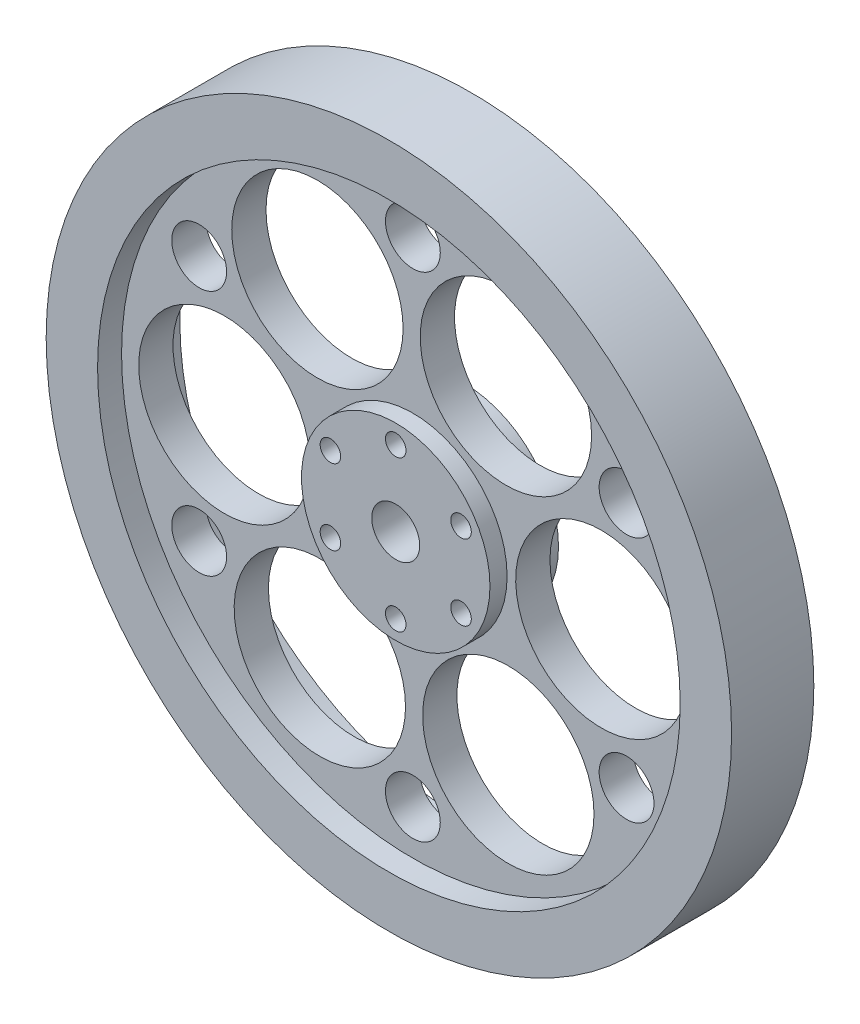
ISO-10303-21;
HEADER;
FILE_DESCRIPTION(('STEP AP214'),'2;1');
FILE_NAME('part.step','',(''),(''),'','','');
FILE_SCHEMA(('AUTOMOTIVE_DESIGN { 1 0 10303 214 1 1 1 1 }'));
ENDSEC;
DATA;
#1=APPLICATION_CONTEXT('core data for automotive mechanical design processes');
#2=APPLICATION_PROTOCOL_DEFINITION('international standard','automotive_design',2000,#1);
#3=PRODUCT_CONTEXT('',#1,'mechanical');
#4=PRODUCT('Part','Part','',(#3));
#5=PRODUCT_RELATED_PRODUCT_CATEGORY('part','',(#4));
#6=PRODUCT_DEFINITION_FORMATION('','',#4);
#7=PRODUCT_DEFINITION_CONTEXT('part definition',#1,'design');
#8=PRODUCT_DEFINITION('design','',#6,#7);
#9=PRODUCT_DEFINITION_SHAPE('','',#8);
#10=(LENGTH_UNIT() NAMED_UNIT(*) SI_UNIT(.MILLI.,.METRE.));
#11=(NAMED_UNIT(*) PLANE_ANGLE_UNIT() SI_UNIT($,.RADIAN.));
#12=(NAMED_UNIT(*) SI_UNIT($,.STERADIAN.) SOLID_ANGLE_UNIT());
#13=UNCERTAINTY_MEASURE_WITH_UNIT(LENGTH_MEASURE(1.E-05),#10,'distance_accuracy_value','');
#14=(GEOMETRIC_REPRESENTATION_CONTEXT(3) GLOBAL_UNCERTAINTY_ASSIGNED_CONTEXT((#13)) GLOBAL_UNIT_ASSIGNED_CONTEXT((#10,
#11,#12)) REPRESENTATION_CONTEXT('',''));
#15=CARTESIAN_POINT('',(0.,0.,0.));
#16=DIRECTION('',(0.,0.,1.));
#17=DIRECTION('',(1.,0.,0.));
#18=AXIS2_PLACEMENT_3D('',#15,#16,#17);
#19=CARTESIAN_POINT('',(0.,0.,-10.));
#20=DIRECTION('',(0.,0.,1.));
#21=DIRECTION('',(1.,0.,0.));
#22=AXIS2_PLACEMENT_3D('',#19,#20,#21);
#23=CYLINDRICAL_SURFACE('',#22,27.5);
#24=CARTESIAN_POINT('',(0.,0.,-10.));
#25=DIRECTION('',(0.,0.,1.));
#26=DIRECTION('',(1.,0.,0.));
#27=AXIS2_PLACEMENT_3D('',#24,#25,#26);
#28=CIRCLE('',#27,27.5);
#29=CARTESIAN_POINT('',(27.5,0.,-10.));
#30=VERTEX_POINT('',#29);
#31=EDGE_CURVE('E46',#30,#30,#28,.T.);
#32=ORIENTED_EDGE('',*,*,#31,.T.);
#33=EDGE_LOOP('',(#32));
#34=FACE_BOUND('',#33,.T.);
#35=CARTESIAN_POINT('',(0.,0.,-5.));
#36=DIRECTION('',(0.,0.,1.));
#37=DIRECTION('',(1.,0.,0.));
#38=AXIS2_PLACEMENT_3D('',#35,#36,#37);
#39=CIRCLE('',#38,27.5);
#40=CARTESIAN_POINT('',(27.5,0.,-5.));
#41=VERTEX_POINT('',#40);
#42=EDGE_CURVE('E175',#41,#41,#39,.T.);
#43=ORIENTED_EDGE('',*,*,#42,.F.);
#44=EDGE_LOOP('',(#43));
#45=FACE_BOUND('',#44,.T.);
#46=ADVANCED_FACE('F38',(#34,#45),#23,.T.);
#47=CARTESIAN_POINT('',(0.,0.,-10.));
#48=DIRECTION('',(0.,0.,1.));
#49=DIRECTION('',(1.,0.,0.));
#50=AXIS2_PLACEMENT_3D('',#47,#48,#49);
#51=PLANE('',#50);
#52=CARTESIAN_POINT('',(19.0525588832581,11.0000000000008,-10.));
#53=DIRECTION('',(0.,0.,1.));
#54=DIRECTION('',(1.,0.,0.));
#55=AXIS2_PLACEMENT_3D('',#52,#53,#54);
#56=CIRCLE('',#55,3.);
#57=CARTESIAN_POINT('',(22.0525588832581,11.0000000000008,-10.));
#58=VERTEX_POINT('',#57);
#59=EDGE_CURVE('E151',#58,#58,#56,.T.);
#60=ORIENTED_EDGE('',*,*,#59,.T.);
#61=EDGE_LOOP('',(#60));
#62=FACE_BOUND('',#61,.T.);
#63=CARTESIAN_POINT('',(0.,22.,-10.));
#64=DIRECTION('',(0.,0.,1.));
#65=DIRECTION('',(1.,0.,0.));
#66=AXIS2_PLACEMENT_3D('',#63,#64,#65);
#67=CIRCLE('',#66,3.);
#68=CARTESIAN_POINT('',(3.,22.,-10.));
#69=VERTEX_POINT('',#68);
#70=EDGE_CURVE('E148',#69,#69,#67,.T.);
#71=ORIENTED_EDGE('',*,*,#70,.T.);
#72=EDGE_LOOP('',(#71));
#73=FACE_BOUND('',#72,.T.);
#74=CARTESIAN_POINT('',(-19.0525588832572,10.9999999999992,-10.));
#75=DIRECTION('',(0.,0.,1.));
#76=DIRECTION('',(1.,0.,0.));
#77=AXIS2_PLACEMENT_3D('',#74,#75,#76);
#78=CIRCLE('',#77,3.);
#79=CARTESIAN_POINT('',(-16.0525588832572,10.9999999999992,-10.));
#80=VERTEX_POINT('',#79);
#81=EDGE_CURVE('E145',#80,#80,#78,.T.);
#82=ORIENTED_EDGE('',*,*,#81,.T.);
#83=EDGE_LOOP('',(#82));
#84=FACE_BOUND('',#83,.T.);
#85=CARTESIAN_POINT('',(19.052558883259,-10.9999999999992,-10.));
#86=DIRECTION('',(0.,0.,1.));
#87=DIRECTION('',(1.,0.,0.));
#88=AXIS2_PLACEMENT_3D('',#85,#86,#87);
#89=CIRCLE('',#88,3.);
#90=CARTESIAN_POINT('',(22.052558883259,-10.9999999999992,-10.));
#91=VERTEX_POINT('',#90);
#92=EDGE_CURVE('E142',#91,#91,#89,.T.);
#93=ORIENTED_EDGE('',*,*,#92,.T.);
#94=EDGE_LOOP('',(#93));
#95=FACE_BOUND('',#94,.T.);
#96=CARTESIAN_POINT('',(1.83646022075986E-12,-22.,-10.));
#97=DIRECTION('',(0.,0.,1.));
#98=DIRECTION('',(1.,0.,0.));
#99=AXIS2_PLACEMENT_3D('',#96,#97,#98);
#100=CIRCLE('',#99,3.);
#101=CARTESIAN_POINT('',(3.00000000000184,-22.,-10.));
#102=VERTEX_POINT('',#101);
#103=EDGE_CURVE('E139',#102,#102,#100,.T.);
#104=ORIENTED_EDGE('',*,*,#103,.T.);
#105=EDGE_LOOP('',(#104));
#106=FACE_BOUND('',#105,.T.);
#107=CARTESIAN_POINT('',(-19.0525588832563,-11.0000000000008,-10.));
#108=DIRECTION('',(0.,0.,1.));
#109=DIRECTION('',(1.,0.,0.));
#110=AXIS2_PLACEMENT_3D('',#107,#108,#109);
#111=CIRCLE('',#110,3.);
#112=CARTESIAN_POINT('',(-16.0525588832563,-11.0000000000008,-10.));
#113=VERTEX_POINT('',#112);
#114=EDGE_CURVE('E136',#113,#113,#111,.T.);
#115=ORIENTED_EDGE('',*,*,#114,.T.);
#116=EDGE_LOOP('',(#115));
#117=FACE_BOUND('',#116,.T.);
#118=CARTESIAN_POINT('',(0.,0.,-10.));
#119=DIRECTION('',(0.,0.,1.));
#120=DIRECTION('',(1.,0.,0.));
#121=AXIS2_PLACEMENT_3D('',#118,#119,#120);
#122=CIRCLE('',#121,7.);
#123=CARTESIAN_POINT('',(7.,0.,-10.));
#124=VERTEX_POINT('',#123);
#125=EDGE_CURVE('E157',#124,#124,#122,.T.);
#126=ORIENTED_EDGE('',*,*,#125,.T.);
#127=EDGE_LOOP('',(#126));
#128=FACE_BOUND('',#127,.T.);
#129=ORIENTED_EDGE('',*,*,#31,.F.);
#130=EDGE_LOOP('',(#129));
#131=FACE_BOUND('',#130,.T.);
#132=ADVANCED_FACE('F199',(#62,#73,#84,#95,#106,#117,#128,#131),#51,.F.);
#133=CARTESIAN_POINT('',(0.,0.,-5.));
#134=DIRECTION('',(0.,0.,1.));
#135=DIRECTION('',(1.,0.,0.));
#136=AXIS2_PLACEMENT_3D('',#133,#134,#135);
#137=PLANE('',#136);
#138=CARTESIAN_POINT('',(-27.1468431942554,-47.8335541705455,-5.));
#139=DIRECTION('',(0.,0.,-1.));
#140=DIRECTION('',(0.500000000000004,-0.866025403784436,0.));
#141=AXIS2_PLACEMENT_3D('',#138,#139,#140);
#142=CIRCLE('',#141,25.);
#143=CARTESIAN_POINT('',(-14.6468431942553,-69.4841892651564,-5.));
#144=VERTEX_POINT('',#143);
#145=EDGE_CURVE('E324',#144,#144,#142,.T.);
#146=ORIENTED_EDGE('',*,*,#145,.F.);
#147=EDGE_LOOP('',(#146));
#148=FACE_BOUND('',#147,.T.);
#149=CARTESIAN_POINT('',(27.8516514678636,-47.4266329240507,-5.));
#150=DIRECTION('',(0.,0.,-1.));
#151=DIRECTION('',(1.,0.,0.));
#152=AXIS2_PLACEMENT_3D('',#149,#150,#151);
#153=CIRCLE('',#152,25.);
#154=CARTESIAN_POINT('',(52.8516514678636,-47.4266329240507,-5.));
#155=VERTEX_POINT('',#154);
#156=EDGE_CURVE('E321',#155,#155,#153,.T.);
#157=ORIENTED_EDGE('',*,*,#156,.F.);
#158=EDGE_LOOP('',(#157));
#159=FACE_BOUND('',#158,.T.);
#160=CARTESIAN_POINT('',(27.146843194255,47.8335541705457,-5.));
#161=DIRECTION('',(0.,0.,-1.));
#162=DIRECTION('',(-0.50000000000001,0.866025403784433,0.));
#163=AXIS2_PLACEMENT_3D('',#160,#161,#162);
#164=CIRCLE('',#163,25.);
#165=CARTESIAN_POINT('',(14.6468431942548,69.4841892651565,-5.));
#166=VERTEX_POINT('',#165);
#167=EDGE_CURVE('E316',#166,#166,#164,.T.);
#168=ORIENTED_EDGE('',*,*,#167,.F.);
#169=EDGE_LOOP('',(#168));
#170=FACE_BOUND('',#169,.T.);
#171=CARTESIAN_POINT('',(54.9984946621192,0.406921246495152,-5.));
#172=DIRECTION('',(0.,0.,-1.));
#173=DIRECTION('',(0.499999999999992,0.866025403784443,0.));
#174=AXIS2_PLACEMENT_3D('',#171,#172,#173);
#175=CIRCLE('',#174,25.);
#176=CARTESIAN_POINT('',(67.498494662119,22.0575563411062,-5.));
#177=VERTEX_POINT('',#176);
#178=EDGE_CURVE('E318',#177,#177,#175,.T.);
#179=ORIENTED_EDGE('',*,*,#178,.F.);
#180=EDGE_LOOP('',(#179));
#181=FACE_BOUND('',#180,.T.);
#182=CARTESIAN_POINT('',(-54.9984946621192,-0.40692124649477,-5.));
#183=DIRECTION('',(0.,0.,-1.));
#184=DIRECTION('',(-0.499999999999998,-0.86602540378444,0.));
#185=AXIS2_PLACEMENT_3D('',#182,#183,#184);
#186=CIRCLE('',#185,25.);
#187=CARTESIAN_POINT('',(-67.4984946621191,-22.0575563411058,-5.));
#188=VERTEX_POINT('',#187);
#189=EDGE_CURVE('E89',#188,#188,#186,.T.);
#190=ORIENTED_EDGE('',*,*,#189,.F.);
#191=EDGE_LOOP('',(#190));
#192=FACE_BOUND('',#191,.T.);
#193=CARTESIAN_POINT('',(-27.8516514678636,47.4266329240507,-5.));
#194=DIRECTION('',(0.,0.,-1.));
#195=DIRECTION('',(-1.,0.,0.));
#196=AXIS2_PLACEMENT_3D('',#193,#194,#195);
#197=CIRCLE('',#196,25.);
#198=CARTESIAN_POINT('',(-52.8516514678636,47.4266329240507,-5.));
#199=VERTEX_POINT('',#198);
#200=EDGE_CURVE('E84',#199,#199,#197,.T.);
#201=ORIENTED_EDGE('',*,*,#200,.F.);
#202=EDGE_LOOP('',(#201));
#203=FACE_BOUND('',#202,.T.);
#204=CARTESIAN_POINT('',(-62.3538290724782,-36.0000000000008,-5.));
#205=DIRECTION('',(0.,0.,1.));
#206=DIRECTION('',(1.,0.,0.));
#207=AXIS2_PLACEMENT_3D('',#204,#205,#206);
#208=CIRCLE('',#207,8.);
#209=CARTESIAN_POINT('',(-54.3538290724782,-36.0000000000008,-5.));
#210=VERTEX_POINT('',#209);
#211=EDGE_CURVE('E79',#210,#210,#208,.T.);
#212=ORIENTED_EDGE('',*,*,#211,.T.);
#213=EDGE_LOOP('',(#212));
#214=FACE_BOUND('',#213,.T.);
#215=CARTESIAN_POINT('',(1.8425834547556E-12,-72.,-5.));
#216=DIRECTION('',(0.,0.,1.));
#217=DIRECTION('',(1.,0.,0.));
#218=AXIS2_PLACEMENT_3D('',#215,#216,#217);
#219=CIRCLE('',#218,8.);
#220=CARTESIAN_POINT('',(8.00000000000184,-72.,-5.));
#221=VERTEX_POINT('',#220);
#222=EDGE_CURVE('E75',#221,#221,#219,.T.);
#223=ORIENTED_EDGE('',*,*,#222,.T.);
#224=EDGE_LOOP('',(#223));
#225=FACE_BOUND('',#224,.T.);
#226=CARTESIAN_POINT('',(62.353829072481,-35.9999999999992,-5.));
#227=DIRECTION('',(0.,0.,1.));
#228=DIRECTION('',(1.,0.,0.));
#229=AXIS2_PLACEMENT_3D('',#226,#227,#228);
#230=CIRCLE('',#229,8.00000000000001);
#231=CARTESIAN_POINT('',(70.353829072481,-35.9999999999992,-5.));
#232=VERTEX_POINT('',#231);
#233=EDGE_CURVE('E71',#232,#232,#230,.T.);
#234=ORIENTED_EDGE('',*,*,#233,.T.);
#235=EDGE_LOOP('',(#234));
#236=FACE_BOUND('',#235,.T.);
#237=CARTESIAN_POINT('',(62.35382907248,36.0000000000008,-5.));
#238=DIRECTION('',(0.,0.,1.));
#239=DIRECTION('',(1.,0.,0.));
#240=AXIS2_PLACEMENT_3D('',#237,#238,#239);
#241=CIRCLE('',#240,8.);
#242=CARTESIAN_POINT('',(70.35382907248,36.0000000000008,-5.));
#243=VERTEX_POINT('',#242);
#244=EDGE_CURVE('E67',#243,#243,#241,.T.);
#245=ORIENTED_EDGE('',*,*,#244,.T.);
#246=EDGE_LOOP('',(#245));
#247=FACE_BOUND('',#246,.T.);
#248=CARTESIAN_POINT('',(0.,72.,-5.));
#249=DIRECTION('',(0.,0.,1.));
#250=DIRECTION('',(1.,0.,0.));
#251=AXIS2_PLACEMENT_3D('',#248,#249,#250);
#252=CIRCLE('',#251,8.);
#253=CARTESIAN_POINT('',(8.,72.,-5.));
#254=VERTEX_POINT('',#253);
#255=EDGE_CURVE('E63',#254,#254,#252,.T.);
#256=ORIENTED_EDGE('',*,*,#255,.T.);
#257=EDGE_LOOP('',(#256));
#258=FACE_BOUND('',#257,.T.);
#259=CARTESIAN_POINT('',(-62.3538290724792,35.9999999999992,-5.));
#260=DIRECTION('',(0.,0.,1.));
#261=DIRECTION('',(1.,0.,0.));
#262=AXIS2_PLACEMENT_3D('',#259,#260,#261);
#263=CIRCLE('',#262,8.);
#264=CARTESIAN_POINT('',(-54.3538290724792,35.9999999999992,-5.));
#265=VERTEX_POINT('',#264);
#266=EDGE_CURVE('E58',#265,#265,#263,.T.);
#267=ORIENTED_EDGE('',*,*,#266,.T.);
#268=EDGE_LOOP('',(#267));
#269=FACE_BOUND('',#268,.T.);
#270=ORIENTED_EDGE('',*,*,#42,.T.);
#271=EDGE_LOOP('',(#270));
#272=FACE_BOUND('',#271,.T.);
#273=CARTESIAN_POINT('',(0.,0.,-5.));
#274=DIRECTION('',(0.,0.,1.));
#275=DIRECTION('',(1.,0.,0.));
#276=AXIS2_PLACEMENT_3D('',#273,#274,#275);
#277=CIRCLE('',#276,85.);
#278=CARTESIAN_POINT('',(85.,0.,-5.));
#279=VERTEX_POINT('',#278);
#280=EDGE_CURVE('E178',#279,#279,#277,.T.);
#281=ORIENTED_EDGE('',*,*,#280,.F.);
#282=EDGE_LOOP('',(#281));
#283=FACE_BOUND('',#282,.T.);
#284=ADVANCED_FACE('F204',(#148,#159,#170,#181,#192,#203,#214,#225,#236,#247,#258,#269,#272,
#283),#137,.F.);
#285=CARTESIAN_POINT('',(0.,0.,-12.));
#286=DIRECTION('',(0.,0.,1.));
#287=DIRECTION('',(1.,0.,0.));
#288=AXIS2_PLACEMENT_3D('',#285,#286,#287);
#289=CYLINDRICAL_SURFACE('',#288,85.);
#290=CARTESIAN_POINT('',(0.,0.,-12.));
#291=DIRECTION('',(0.,0.,1.));
#292=DIRECTION('',(1.,0.,0.));
#293=AXIS2_PLACEMENT_3D('',#290,#291,#292);
#294=CIRCLE('',#293,85.);
#295=CARTESIAN_POINT('',(85.,0.,-12.));
#296=VERTEX_POINT('',#295);
#297=EDGE_CURVE('E166',#296,#296,#294,.T.);
#298=ORIENTED_EDGE('',*,*,#297,.F.);
#299=EDGE_LOOP('',(#298));
#300=FACE_BOUND('',#299,.T.);
#301=ORIENTED_EDGE('',*,*,#280,.T.);
#302=EDGE_LOOP('',(#301));
#303=FACE_BOUND('',#302,.T.);
#304=ADVANCED_FACE('F212',(#300,#303),#289,.F.);
#305=CARTESIAN_POINT('',(0.,0.,5.));
#306=DIRECTION('',(0.,0.,1.));
#307=DIRECTION('',(1.,0.,0.));
#308=AXIS2_PLACEMENT_3D('',#305,#306,#307);
#309=CIRCLE('',#308,85.);
#310=CARTESIAN_POINT('',(85.,0.,5.));
#311=VERTEX_POINT('',#310);
#312=EDGE_CURVE('E172',#311,#311,#309,.T.);
#313=ORIENTED_EDGE('',*,*,#312,.F.);
#314=EDGE_LOOP('',(#313));
#315=FACE_BOUND('',#314,.T.);
#316=CARTESIAN_POINT('',(0.,0.,12.));
#317=DIRECTION('',(0.,0.,1.));
#318=DIRECTION('',(1.,0.,0.));
#319=AXIS2_PLACEMENT_3D('',#316,#317,#318);
#320=CIRCLE('',#319,85.);
#321=CARTESIAN_POINT('',(85.,0.,12.));
#322=VERTEX_POINT('',#321);
#323=EDGE_CURVE('E160',#322,#322,#320,.T.);
#324=ORIENTED_EDGE('',*,*,#323,.T.);
#325=EDGE_LOOP('',(#324));
#326=FACE_BOUND('',#325,.T.);
#327=ADVANCED_FACE('F218',(#315,#326),#289,.F.);
#328=CARTESIAN_POINT('',(0.,0.,-12.));
#329=DIRECTION('',(0.,0.,1.));
#330=DIRECTION('',(1.,0.,0.));
#331=AXIS2_PLACEMENT_3D('',#328,#329,#330);
#332=CYLINDRICAL_SURFACE('',#331,100.);
#333=CARTESIAN_POINT('',(0.,0.,-12.));
#334=DIRECTION('',(0.,0.,1.));
#335=DIRECTION('',(1.,0.,0.));
#336=AXIS2_PLACEMENT_3D('',#333,#334,#335);
#337=CIRCLE('',#336,100.);
#338=CARTESIAN_POINT('',(100.,0.,-12.));
#339=VERTEX_POINT('',#338);
#340=EDGE_CURVE('E169',#339,#339,#337,.T.);
#341=ORIENTED_EDGE('',*,*,#340,.T.);
#342=EDGE_LOOP('',(#341));
#343=FACE_BOUND('',#342,.T.);
#344=CARTESIAN_POINT('',(0.,0.,12.));
#345=DIRECTION('',(0.,0.,1.));
#346=DIRECTION('',(1.,0.,0.));
#347=AXIS2_PLACEMENT_3D('',#344,#345,#346);
#348=CIRCLE('',#347,100.);
#349=CARTESIAN_POINT('',(100.,0.,12.));
#350=VERTEX_POINT('',#349);
#351=EDGE_CURVE('E163',#350,#350,#348,.T.);
#352=ORIENTED_EDGE('',*,*,#351,.F.);
#353=EDGE_LOOP('',(#352));
#354=FACE_BOUND('',#353,.T.);
#355=ADVANCED_FACE('F224',(#343,#354),#332,.T.);
#356=CARTESIAN_POINT('',(0.,0.,-12.));
#357=DIRECTION('',(0.,0.,1.));
#358=DIRECTION('',(1.,0.,0.));
#359=AXIS2_PLACEMENT_3D('',#356,#357,#358);
#360=PLANE('',#359);
#361=ORIENTED_EDGE('',*,*,#297,.T.);
#362=EDGE_LOOP('',(#361));
#363=FACE_BOUND('',#362,.T.);
#364=ORIENTED_EDGE('',*,*,#340,.F.);
#365=EDGE_LOOP('',(#364));
#366=FACE_BOUND('',#365,.T.);
#367=ADVANCED_FACE('F230',(#363,#366),#360,.F.);
#368=CARTESIAN_POINT('',(0.,0.,12.));
#369=DIRECTION('',(0.,0.,1.));
#370=DIRECTION('',(1.,0.,0.));
#371=AXIS2_PLACEMENT_3D('',#368,#369,#370);
#372=PLANE('',#371);
#373=ORIENTED_EDGE('',*,*,#323,.F.);
#374=EDGE_LOOP('',(#373));
#375=FACE_BOUND('',#374,.T.);
#376=ORIENTED_EDGE('',*,*,#351,.T.);
#377=EDGE_LOOP('',(#376));
#378=FACE_BOUND('',#377,.T.);
#379=ADVANCED_FACE('F195',(#375,#378),#372,.T.);
#380=CARTESIAN_POINT('',(0.,0.,10.));
#381=DIRECTION('',(0.,0.,1.));
#382=DIRECTION('',(1.,0.,0.));
#383=AXIS2_PLACEMENT_3D('',#380,#381,#382);
#384=PLANE('',#383);
#385=CARTESIAN_POINT('',(19.0525588832581,11.0000000000008,10.));
#386=DIRECTION('',(0.,0.,1.));
#387=DIRECTION('',(1.,0.,0.));
#388=AXIS2_PLACEMENT_3D('',#385,#386,#387);
#389=CIRCLE('',#388,3.);
#390=CARTESIAN_POINT('',(22.0525588832581,11.0000000000008,10.));
#391=VERTEX_POINT('',#390);
#392=EDGE_CURVE('E111',#391,#391,#389,.T.);
#393=ORIENTED_EDGE('',*,*,#392,.F.);
#394=EDGE_LOOP('',(#393));
#395=FACE_BOUND('',#394,.T.);
#396=CARTESIAN_POINT('',(0.,22.,10.));
#397=DIRECTION('',(0.,0.,1.));
#398=DIRECTION('',(1.,0.,0.));
#399=AXIS2_PLACEMENT_3D('',#396,#397,#398);
#400=CIRCLE('',#399,3.);
#401=CARTESIAN_POINT('',(3.,22.,10.));
#402=VERTEX_POINT('',#401);
#403=EDGE_CURVE('E119',#402,#402,#400,.T.);
#404=ORIENTED_EDGE('',*,*,#403,.F.);
#405=EDGE_LOOP('',(#404));
#406=FACE_BOUND('',#405,.T.);
#407=CARTESIAN_POINT('',(-19.0525588832572,10.9999999999992,10.));
#408=DIRECTION('',(0.,0.,1.));
#409=DIRECTION('',(1.,0.,0.));
#410=AXIS2_PLACEMENT_3D('',#407,#408,#409);
#411=CIRCLE('',#410,3.);
#412=CARTESIAN_POINT('',(-16.0525588832572,10.9999999999992,10.));
#413=VERTEX_POINT('',#412);
#414=EDGE_CURVE('E59',#413,#413,#411,.T.);
#415=ORIENTED_EDGE('',*,*,#414,.F.);
#416=EDGE_LOOP('',(#415));
#417=FACE_BOUND('',#416,.T.);
#418=CARTESIAN_POINT('',(19.052558883259,-10.9999999999992,10.));
#419=DIRECTION('',(0.,0.,1.));
#420=DIRECTION('',(1.,0.,0.));
#421=AXIS2_PLACEMENT_3D('',#418,#419,#420);
#422=CIRCLE('',#421,3.);
#423=CARTESIAN_POINT('',(22.052558883259,-10.9999999999992,10.));
#424=VERTEX_POINT('',#423);
#425=EDGE_CURVE('E108',#424,#424,#422,.T.);
#426=ORIENTED_EDGE('',*,*,#425,.F.);
#427=EDGE_LOOP('',(#426));
#428=FACE_BOUND('',#427,.T.);
#429=CARTESIAN_POINT('',(1.83646022075986E-12,-22.,10.));
#430=DIRECTION('',(0.,0.,1.));
#431=DIRECTION('',(1.,0.,0.));
#432=AXIS2_PLACEMENT_3D('',#429,#430,#431);
#433=CIRCLE('',#432,3.);
#434=CARTESIAN_POINT('',(3.00000000000184,-22.,10.));
#435=VERTEX_POINT('',#434);
#436=EDGE_CURVE('E112',#435,#435,#433,.T.);
#437=ORIENTED_EDGE('',*,*,#436,.F.);
#438=EDGE_LOOP('',(#437));
#439=FACE_BOUND('',#438,.T.);
#440=CARTESIAN_POINT('',(-19.0525588832563,-11.0000000000008,10.));
#441=DIRECTION('',(0.,0.,1.));
#442=DIRECTION('',(1.,0.,0.));
#443=AXIS2_PLACEMENT_3D('',#440,#441,#442);
#444=CIRCLE('',#443,3.);
#445=CARTESIAN_POINT('',(-16.0525588832563,-11.0000000000008,10.));
#446=VERTEX_POINT('',#445);
#447=EDGE_CURVE('E83',#446,#446,#444,.T.);
#448=ORIENTED_EDGE('',*,*,#447,.F.);
#449=EDGE_LOOP('',(#448));
#450=FACE_BOUND('',#449,.T.);
#451=CARTESIAN_POINT('',(0.,0.,10.));
#452=DIRECTION('',(0.,0.,1.));
#453=DIRECTION('',(1.,0.,0.));
#454=AXIS2_PLACEMENT_3D('',#451,#452,#453);
#455=CIRCLE('',#454,7.);
#456=CARTESIAN_POINT('',(7.,0.,10.));
#457=VERTEX_POINT('',#456);
#458=EDGE_CURVE('E154',#457,#457,#455,.T.);
#459=ORIENTED_EDGE('',*,*,#458,.F.);
#460=EDGE_LOOP('',(#459));
#461=FACE_BOUND('',#460,.T.);
#462=CARTESIAN_POINT('',(0.,0.,10.));
#463=DIRECTION('',(0.,0.,1.));
#464=DIRECTION('',(1.,0.,0.));
#465=AXIS2_PLACEMENT_3D('',#462,#463,#464);
#466=CIRCLE('',#465,27.5);
#467=CARTESIAN_POINT('',(27.5,0.,10.));
#468=VERTEX_POINT('',#467);
#469=EDGE_CURVE('E51',#468,#468,#466,.T.);
#470=ORIENTED_EDGE('',*,*,#469,.T.);
#471=EDGE_LOOP('',(#470));
#472=FACE_BOUND('',#471,.T.);
#473=ADVANCED_FACE('F183',(#395,#406,#417,#428,#439,#450,#461,#472),#384,.T.);
#474=CARTESIAN_POINT('',(0.,0.,5.));
#475=DIRECTION('',(0.,0.,1.));
#476=DIRECTION('',(1.,0.,0.));
#477=AXIS2_PLACEMENT_3D('',#474,#475,#476);
#478=CIRCLE('',#477,27.5);
#479=CARTESIAN_POINT('',(27.5,0.,5.));
#480=VERTEX_POINT('',#479);
#481=EDGE_CURVE('E10',#480,#480,#478,.F.);
#482=ORIENTED_EDGE('',*,*,#481,.F.);
#483=EDGE_LOOP('',(#482));
#484=FACE_BOUND('',#483,.T.);
#485=ORIENTED_EDGE('',*,*,#469,.F.);
#486=EDGE_LOOP('',(#485));
#487=FACE_BOUND('',#486,.T.);
#488=ADVANCED_FACE('F40',(#484,#487),#23,.T.);
#489=CARTESIAN_POINT('',(0.,0.,5.));
#490=DIRECTION('',(0.,0.,1.));
#491=DIRECTION('',(1.,0.,0.));
#492=AXIS2_PLACEMENT_3D('',#489,#490,#491);
#493=PLANE('',#492);
#494=CARTESIAN_POINT('',(-27.1468431942554,-47.8335541705455,5.));
#495=DIRECTION('',(0.,0.,1.));
#496=DIRECTION('',(1.,0.,0.));
#497=AXIS2_PLACEMENT_3D('',#494,#495,#496);
#498=CIRCLE('',#497,25.);
#499=CARTESIAN_POINT('',(-2.14684319425539,-47.8335541705455,5.));
#500=VERTEX_POINT('',#499);
#501=EDGE_CURVE('E42',#500,#500,#498,.T.);
#502=ORIENTED_EDGE('',*,*,#501,.F.);
#503=EDGE_LOOP('',(#502));
#504=FACE_BOUND('',#503,.T.);
#505=CARTESIAN_POINT('',(27.8516514678636,-47.4266329240507,5.));
#506=DIRECTION('',(0.,0.,1.));
#507=DIRECTION('',(1.,0.,0.));
#508=AXIS2_PLACEMENT_3D('',#505,#506,#507);
#509=CIRCLE('',#508,25.);
#510=CARTESIAN_POINT('',(52.8516514678636,-47.4266329240507,5.));
#511=VERTEX_POINT('',#510);
#512=EDGE_CURVE('E94',#511,#511,#509,.T.);
#513=ORIENTED_EDGE('',*,*,#512,.F.);
#514=EDGE_LOOP('',(#513));
#515=FACE_BOUND('',#514,.T.);
#516=CARTESIAN_POINT('',(27.146843194255,47.8335541705457,5.));
#517=DIRECTION('',(0.,0.,1.));
#518=DIRECTION('',(1.,0.,0.));
#519=AXIS2_PLACEMENT_3D('',#516,#517,#518);
#520=CIRCLE('',#519,25.);
#521=CARTESIAN_POINT('',(52.146843194255,47.8335541705457,5.));
#522=VERTEX_POINT('',#521);
#523=EDGE_CURVE('E92',#522,#522,#520,.T.);
#524=ORIENTED_EDGE('',*,*,#523,.F.);
#525=EDGE_LOOP('',(#524));
#526=FACE_BOUND('',#525,.T.);
#527=CARTESIAN_POINT('',(54.9984946621192,0.406921246495152,5.));
#528=DIRECTION('',(0.,0.,1.));
#529=DIRECTION('',(1.,0.,0.));
#530=AXIS2_PLACEMENT_3D('',#527,#528,#529);
#531=CIRCLE('',#530,25.);
#532=CARTESIAN_POINT('',(79.9984946621192,0.406921246495152,5.));
#533=VERTEX_POINT('',#532);
#534=EDGE_CURVE('E88',#533,#533,#531,.T.);
#535=ORIENTED_EDGE('',*,*,#534,.F.);
#536=EDGE_LOOP('',(#535));
#537=FACE_BOUND('',#536,.T.);
#538=CARTESIAN_POINT('',(-54.9984946621192,-0.40692124649477,5.));
#539=DIRECTION('',(0.,0.,1.));
#540=DIRECTION('',(1.,0.,0.));
#541=AXIS2_PLACEMENT_3D('',#538,#539,#540);
#542=CIRCLE('',#541,25.);
#543=CARTESIAN_POINT('',(-29.9984946621192,-0.40692124649477,5.));
#544=VERTEX_POINT('',#543);
#545=EDGE_CURVE('E85',#544,#544,#542,.T.);
#546=ORIENTED_EDGE('',*,*,#545,.F.);
#547=EDGE_LOOP('',(#546));
#548=FACE_BOUND('',#547,.T.);
#549=CARTESIAN_POINT('',(-27.8516514678636,47.4266329240507,5.));
#550=DIRECTION('',(0.,0.,1.));
#551=DIRECTION('',(1.,0.,0.));
#552=AXIS2_PLACEMENT_3D('',#549,#550,#551);
#553=CIRCLE('',#552,25.);
#554=CARTESIAN_POINT('',(-2.85165146786358,47.4266329240507,5.));
#555=VERTEX_POINT('',#554);
#556=EDGE_CURVE('E80',#555,#555,#553,.T.);
#557=ORIENTED_EDGE('',*,*,#556,.F.);
#558=EDGE_LOOP('',(#557));
#559=FACE_BOUND('',#558,.T.);
#560=CARTESIAN_POINT('',(-62.3538290724782,-36.0000000000008,5.));
#561=DIRECTION('',(0.,0.,1.));
#562=DIRECTION('',(1.,0.,0.));
#563=AXIS2_PLACEMENT_3D('',#560,#561,#562);
#564=CIRCLE('',#563,8.);
#565=CARTESIAN_POINT('',(-54.3538290724782,-36.0000000000008,5.));
#566=VERTEX_POINT('',#565);
#567=EDGE_CURVE('E76',#566,#566,#564,.T.);
#568=ORIENTED_EDGE('',*,*,#567,.F.);
#569=EDGE_LOOP('',(#568));
#570=FACE_BOUND('',#569,.T.);
#571=CARTESIAN_POINT('',(1.8425834547556E-12,-72.,5.));
#572=DIRECTION('',(0.,0.,1.));
#573=DIRECTION('',(1.,0.,0.));
#574=AXIS2_PLACEMENT_3D('',#571,#572,#573);
#575=CIRCLE('',#574,8.);
#576=CARTESIAN_POINT('',(8.00000000000184,-72.,5.));
#577=VERTEX_POINT('',#576);
#578=EDGE_CURVE('E72',#577,#577,#575,.T.);
#579=ORIENTED_EDGE('',*,*,#578,.F.);
#580=EDGE_LOOP('',(#579));
#581=FACE_BOUND('',#580,.T.);
#582=CARTESIAN_POINT('',(62.353829072481,-35.9999999999992,5.));
#583=DIRECTION('',(0.,0.,1.));
#584=DIRECTION('',(1.,0.,0.));
#585=AXIS2_PLACEMENT_3D('',#582,#583,#584);
#586=CIRCLE('',#585,8.00000000000001);
#587=CARTESIAN_POINT('',(70.353829072481,-35.9999999999992,5.));
#588=VERTEX_POINT('',#587);
#589=EDGE_CURVE('E68',#588,#588,#586,.T.);
#590=ORIENTED_EDGE('',*,*,#589,.F.);
#591=EDGE_LOOP('',(#590));
#592=FACE_BOUND('',#591,.T.);
#593=CARTESIAN_POINT('',(62.35382907248,36.0000000000008,5.));
#594=DIRECTION('',(0.,0.,1.));
#595=DIRECTION('',(1.,0.,0.));
#596=AXIS2_PLACEMENT_3D('',#593,#594,#595);
#597=CIRCLE('',#596,8.);
#598=CARTESIAN_POINT('',(70.35382907248,36.0000000000008,5.));
#599=VERTEX_POINT('',#598);
#600=EDGE_CURVE('E64',#599,#599,#597,.T.);
#601=ORIENTED_EDGE('',*,*,#600,.F.);
#602=EDGE_LOOP('',(#601));
#603=FACE_BOUND('',#602,.T.);
#604=CARTESIAN_POINT('',(0.,72.,5.));
#605=DIRECTION('',(0.,0.,1.));
#606=DIRECTION('',(1.,0.,0.));
#607=AXIS2_PLACEMENT_3D('',#604,#605,#606);
#608=CIRCLE('',#607,8.);
#609=CARTESIAN_POINT('',(8.,72.,5.));
#610=VERTEX_POINT('',#609);
#611=EDGE_CURVE('E60',#610,#610,#608,.T.);
#612=ORIENTED_EDGE('',*,*,#611,.F.);
#613=EDGE_LOOP('',(#612));
#614=FACE_BOUND('',#613,.T.);
#615=CARTESIAN_POINT('',(-62.3538290724792,35.9999999999992,5.));
#616=DIRECTION('',(0.,0.,1.));
#617=DIRECTION('',(1.,0.,0.));
#618=AXIS2_PLACEMENT_3D('',#615,#616,#617);
#619=CIRCLE('',#618,8.);
#620=CARTESIAN_POINT('',(-54.3538290724792,35.9999999999992,5.));
#621=VERTEX_POINT('',#620);
#622=EDGE_CURVE('E55',#621,#621,#619,.T.);
#623=ORIENTED_EDGE('',*,*,#622,.F.);
#624=EDGE_LOOP('',(#623));
#625=FACE_BOUND('',#624,.T.);
#626=ORIENTED_EDGE('',*,*,#481,.T.);
#627=EDGE_LOOP('',(#626));
#628=FACE_BOUND('',#627,.T.);
#629=ORIENTED_EDGE('',*,*,#312,.T.);
#630=EDGE_LOOP('',(#629));
#631=FACE_BOUND('',#630,.T.);
#632=ADVANCED_FACE('F186',(#504,#515,#526,#537,#548,#559,#570,#581,#592,#603,#614,#625,#628,
#631),#493,.T.);
#633=CARTESIAN_POINT('',(0.,0.,-12.));
#634=DIRECTION('',(0.,0.,1.));
#635=DIRECTION('',(1.,0.,0.));
#636=AXIS2_PLACEMENT_3D('',#633,#634,#635);
#637=CYLINDRICAL_SURFACE('',#636,7.);
#638=ORIENTED_EDGE('',*,*,#458,.T.);
#639=EDGE_LOOP('',(#638));
#640=FACE_BOUND('',#639,.T.);
#641=ORIENTED_EDGE('',*,*,#125,.F.);
#642=EDGE_LOOP('',(#641));
#643=FACE_BOUND('',#642,.T.);
#644=ADVANCED_FACE('F192',(#640,#643),#637,.F.);
#645=CARTESIAN_POINT('',(-62.3538290724792,35.9999999999992,-12.));
#646=DIRECTION('',(0.,0.,1.));
#647=DIRECTION('',(1.,0.,0.));
#648=AXIS2_PLACEMENT_3D('',#645,#646,#647);
#649=CYLINDRICAL_SURFACE('',#648,8.);
#650=ORIENTED_EDGE('',*,*,#622,.T.);
#651=EDGE_LOOP('',(#650));
#652=FACE_BOUND('',#651,.T.);
#653=ORIENTED_EDGE('',*,*,#266,.F.);
#654=EDGE_LOOP('',(#653));
#655=FACE_BOUND('',#654,.T.);
#656=ADVANCED_FACE('F240',(#652,#655),#649,.F.);
#657=CARTESIAN_POINT('',(0.,72.,-12.));
#658=DIRECTION('',(0.,0.,1.));
#659=DIRECTION('',(1.,0.,0.));
#660=AXIS2_PLACEMENT_3D('',#657,#658,#659);
#661=CYLINDRICAL_SURFACE('',#660,8.);
#662=ORIENTED_EDGE('',*,*,#611,.T.);
#663=EDGE_LOOP('',(#662));
#664=FACE_BOUND('',#663,.T.);
#665=ORIENTED_EDGE('',*,*,#255,.F.);
#666=EDGE_LOOP('',(#665));
#667=FACE_BOUND('',#666,.T.);
#668=ADVANCED_FACE('F244',(#664,#667),#661,.F.);
#669=CARTESIAN_POINT('',(62.35382907248,36.0000000000008,-12.));
#670=DIRECTION('',(0.,0.,1.));
#671=DIRECTION('',(1.,0.,0.));
#672=AXIS2_PLACEMENT_3D('',#669,#670,#671);
#673=CYLINDRICAL_SURFACE('',#672,8.);
#674=ORIENTED_EDGE('',*,*,#600,.T.);
#675=EDGE_LOOP('',(#674));
#676=FACE_BOUND('',#675,.T.);
#677=ORIENTED_EDGE('',*,*,#244,.F.);
#678=EDGE_LOOP('',(#677));
#679=FACE_BOUND('',#678,.T.);
#680=ADVANCED_FACE('F254',(#676,#679),#673,.F.);
#681=CARTESIAN_POINT('',(62.353829072481,-35.9999999999992,-12.));
#682=DIRECTION('',(0.,0.,1.));
#683=DIRECTION('',(1.,0.,0.));
#684=AXIS2_PLACEMENT_3D('',#681,#682,#683);
#685=CYLINDRICAL_SURFACE('',#684,8.00000000000001);
#686=ORIENTED_EDGE('',*,*,#589,.T.);
#687=EDGE_LOOP('',(#686));
#688=FACE_BOUND('',#687,.T.);
#689=ORIENTED_EDGE('',*,*,#233,.F.);
#690=EDGE_LOOP('',(#689));
#691=FACE_BOUND('',#690,.T.);
#692=ADVANCED_FACE('F250',(#688,#691),#685,.F.);
#693=CARTESIAN_POINT('',(1.8425834547556E-12,-72.,-12.));
#694=DIRECTION('',(0.,0.,1.));
#695=DIRECTION('',(1.,0.,0.));
#696=AXIS2_PLACEMENT_3D('',#693,#694,#695);
#697=CYLINDRICAL_SURFACE('',#696,8.);
#698=ORIENTED_EDGE('',*,*,#578,.T.);
#699=EDGE_LOOP('',(#698));
#700=FACE_BOUND('',#699,.T.);
#701=ORIENTED_EDGE('',*,*,#222,.F.);
#702=EDGE_LOOP('',(#701));
#703=FACE_BOUND('',#702,.T.);
#704=ADVANCED_FACE('F246',(#700,#703),#697,.F.);
#705=CARTESIAN_POINT('',(-62.3538290724782,-36.0000000000008,-12.));
#706=DIRECTION('',(0.,0.,1.));
#707=DIRECTION('',(1.,0.,0.));
#708=AXIS2_PLACEMENT_3D('',#705,#706,#707);
#709=CYLINDRICAL_SURFACE('',#708,8.);
#710=ORIENTED_EDGE('',*,*,#567,.T.);
#711=EDGE_LOOP('',(#710));
#712=FACE_BOUND('',#711,.T.);
#713=ORIENTED_EDGE('',*,*,#211,.F.);
#714=EDGE_LOOP('',(#713));
#715=FACE_BOUND('',#714,.T.);
#716=ADVANCED_FACE('F249',(#712,#715),#709,.F.);
#717=CARTESIAN_POINT('',(-19.0525588832563,-11.0000000000008,-12.));
#718=DIRECTION('',(0.,0.,1.));
#719=DIRECTION('',(1.,0.,0.));
#720=AXIS2_PLACEMENT_3D('',#717,#718,#719);
#721=CYLINDRICAL_SURFACE('',#720,3.);
#722=ORIENTED_EDGE('',*,*,#447,.T.);
#723=EDGE_LOOP('',(#722));
#724=FACE_BOUND('',#723,.T.);
#725=ORIENTED_EDGE('',*,*,#114,.F.);
#726=EDGE_LOOP('',(#725));
#727=FACE_BOUND('',#726,.T.);
#728=ADVANCED_FACE('F278',(#724,#727),#721,.F.);
#729=CARTESIAN_POINT('',(1.83646022075986E-12,-22.,-12.));
#730=DIRECTION('',(0.,0.,1.));
#731=DIRECTION('',(1.,0.,0.));
#732=AXIS2_PLACEMENT_3D('',#729,#730,#731);
#733=CYLINDRICAL_SURFACE('',#732,3.);
#734=ORIENTED_EDGE('',*,*,#436,.T.);
#735=EDGE_LOOP('',(#734));
#736=FACE_BOUND('',#735,.T.);
#737=ORIENTED_EDGE('',*,*,#103,.F.);
#738=EDGE_LOOP('',(#737));
#739=FACE_BOUND('',#738,.T.);
#740=ADVANCED_FACE('F282',(#736,#739),#733,.F.);
#741=CARTESIAN_POINT('',(19.052558883259,-10.9999999999992,-12.));
#742=DIRECTION('',(0.,0.,1.));
#743=DIRECTION('',(1.,0.,0.));
#744=AXIS2_PLACEMENT_3D('',#741,#742,#743);
#745=CYLINDRICAL_SURFACE('',#744,3.);
#746=ORIENTED_EDGE('',*,*,#425,.T.);
#747=EDGE_LOOP('',(#746));
#748=FACE_BOUND('',#747,.T.);
#749=ORIENTED_EDGE('',*,*,#92,.F.);
#750=EDGE_LOOP('',(#749));
#751=FACE_BOUND('',#750,.T.);
#752=ADVANCED_FACE('F274',(#748,#751),#745,.F.);
#753=CARTESIAN_POINT('',(-19.0525588832572,10.9999999999992,-12.));
#754=DIRECTION('',(0.,0.,1.));
#755=DIRECTION('',(1.,0.,0.));
#756=AXIS2_PLACEMENT_3D('',#753,#754,#755);
#757=CYLINDRICAL_SURFACE('',#756,3.);
#758=ORIENTED_EDGE('',*,*,#414,.T.);
#759=EDGE_LOOP('',(#758));
#760=FACE_BOUND('',#759,.T.);
#761=ORIENTED_EDGE('',*,*,#81,.F.);
#762=EDGE_LOOP('',(#761));
#763=FACE_BOUND('',#762,.T.);
#764=ADVANCED_FACE('F270',(#760,#763),#757,.F.);
#765=CARTESIAN_POINT('',(0.,22.,-12.));
#766=DIRECTION('',(0.,0.,1.));
#767=DIRECTION('',(1.,0.,0.));
#768=AXIS2_PLACEMENT_3D('',#765,#766,#767);
#769=CYLINDRICAL_SURFACE('',#768,3.);
#770=ORIENTED_EDGE('',*,*,#403,.T.);
#771=EDGE_LOOP('',(#770));
#772=FACE_BOUND('',#771,.T.);
#773=ORIENTED_EDGE('',*,*,#70,.F.);
#774=EDGE_LOOP('',(#773));
#775=FACE_BOUND('',#774,.T.);
#776=ADVANCED_FACE('F266',(#772,#775),#769,.F.);
#777=CARTESIAN_POINT('',(19.0525588832581,11.0000000000008,-12.));
#778=DIRECTION('',(0.,0.,1.));
#779=DIRECTION('',(1.,0.,0.));
#780=AXIS2_PLACEMENT_3D('',#777,#778,#779);
#781=CYLINDRICAL_SURFACE('',#780,3.);
#782=ORIENTED_EDGE('',*,*,#392,.T.);
#783=EDGE_LOOP('',(#782));
#784=FACE_BOUND('',#783,.T.);
#785=ORIENTED_EDGE('',*,*,#59,.F.);
#786=EDGE_LOOP('',(#785));
#787=FACE_BOUND('',#786,.T.);
#788=ADVANCED_FACE('F262',(#784,#787),#781,.F.);
#789=CARTESIAN_POINT('',(-27.8516514678636,47.4266329240507,12.));
#790=DIRECTION('',(0.,0.,-1.));
#791=DIRECTION('',(-1.,0.,0.));
#792=AXIS2_PLACEMENT_3D('',#789,#790,#791);
#793=CYLINDRICAL_SURFACE('',#792,25.);
#794=ORIENTED_EDGE('',*,*,#556,.T.);
#795=EDGE_LOOP('',(#794));
#796=FACE_BOUND('',#795,.T.);
#797=ORIENTED_EDGE('',*,*,#200,.T.);
#798=EDGE_LOOP('',(#797));
#799=FACE_BOUND('',#798,.T.);
#800=ADVANCED_FACE('F265',(#796,#799),#793,.F.);
#801=CARTESIAN_POINT('',(-54.9984946621192,-0.40692124649477,12.));
#802=DIRECTION('',(0.,0.,-1.));
#803=DIRECTION('',(-1.,0.,0.));
#804=AXIS2_PLACEMENT_3D('',#801,#802,#803);
#805=CYLINDRICAL_SURFACE('',#804,25.);
#806=ORIENTED_EDGE('',*,*,#545,.T.);
#807=EDGE_LOOP('',(#806));
#808=FACE_BOUND('',#807,.T.);
#809=ORIENTED_EDGE('',*,*,#189,.T.);
#810=EDGE_LOOP('',(#809));
#811=FACE_BOUND('',#810,.T.);
#812=ADVANCED_FACE('F292',(#808,#811),#805,.F.);
#813=CARTESIAN_POINT('',(54.9984946621192,0.406921246495152,12.));
#814=DIRECTION('',(0.,0.,-1.));
#815=DIRECTION('',(-1.,0.,0.));
#816=AXIS2_PLACEMENT_3D('',#813,#814,#815);
#817=CYLINDRICAL_SURFACE('',#816,25.);
#818=ORIENTED_EDGE('',*,*,#534,.T.);
#819=EDGE_LOOP('',(#818));
#820=FACE_BOUND('',#819,.T.);
#821=ORIENTED_EDGE('',*,*,#178,.T.);
#822=EDGE_LOOP('',(#821));
#823=FACE_BOUND('',#822,.T.);
#824=ADVANCED_FACE('F296',(#820,#823),#817,.F.);
#825=CARTESIAN_POINT('',(27.146843194255,47.8335541705457,12.));
#826=DIRECTION('',(0.,0.,-1.));
#827=DIRECTION('',(-1.,0.,0.));
#828=AXIS2_PLACEMENT_3D('',#825,#826,#827);
#829=CYLINDRICAL_SURFACE('',#828,25.);
#830=ORIENTED_EDGE('',*,*,#523,.T.);
#831=EDGE_LOOP('',(#830));
#832=FACE_BOUND('',#831,.T.);
#833=ORIENTED_EDGE('',*,*,#167,.T.);
#834=EDGE_LOOP('',(#833));
#835=FACE_BOUND('',#834,.T.);
#836=ADVANCED_FACE('F302',(#832,#835),#829,.F.);
#837=CARTESIAN_POINT('',(27.8516514678636,-47.4266329240507,12.));
#838=DIRECTION('',(0.,0.,-1.));
#839=DIRECTION('',(-1.,0.,0.));
#840=AXIS2_PLACEMENT_3D('',#837,#838,#839);
#841=CYLINDRICAL_SURFACE('',#840,25.);
#842=ORIENTED_EDGE('',*,*,#512,.T.);
#843=EDGE_LOOP('',(#842));
#844=FACE_BOUND('',#843,.T.);
#845=ORIENTED_EDGE('',*,*,#156,.T.);
#846=EDGE_LOOP('',(#845));
#847=FACE_BOUND('',#846,.T.);
#848=ADVANCED_FACE('F298',(#844,#847),#841,.F.);
#849=CARTESIAN_POINT('',(-27.1468431942554,-47.8335541705455,12.));
#850=DIRECTION('',(0.,0.,-1.));
#851=DIRECTION('',(-1.,0.,0.));
#852=AXIS2_PLACEMENT_3D('',#849,#850,#851);
#853=CYLINDRICAL_SURFACE('',#852,25.);
#854=ORIENTED_EDGE('',*,*,#501,.T.);
#855=EDGE_LOOP('',(#854));
#856=FACE_BOUND('',#855,.T.);
#857=ORIENTED_EDGE('',*,*,#145,.T.);
#858=EDGE_LOOP('',(#857));
#859=FACE_BOUND('',#858,.T.);
#860=ADVANCED_FACE('F301',(#856,#859),#853,.F.);
#861=CLOSED_SHELL('',(#46,#132,#284,#304,#327,#355,#367,#379,#473,#488,#632,#644,#656,#668,#680,
#692,#704,#716,#728,#740,#752,#764,#776,#788,#800,#812,#824,#836,#848,#860));
#862=MANIFOLD_SOLID_BREP('B2',#861);
#863=ADVANCED_BREP_SHAPE_REPRESENTATION('',(#18,#862),#14);
#864=SHAPE_DEFINITION_REPRESENTATION(#9,#863);
ENDSEC;
END-ISO-10303-21;
